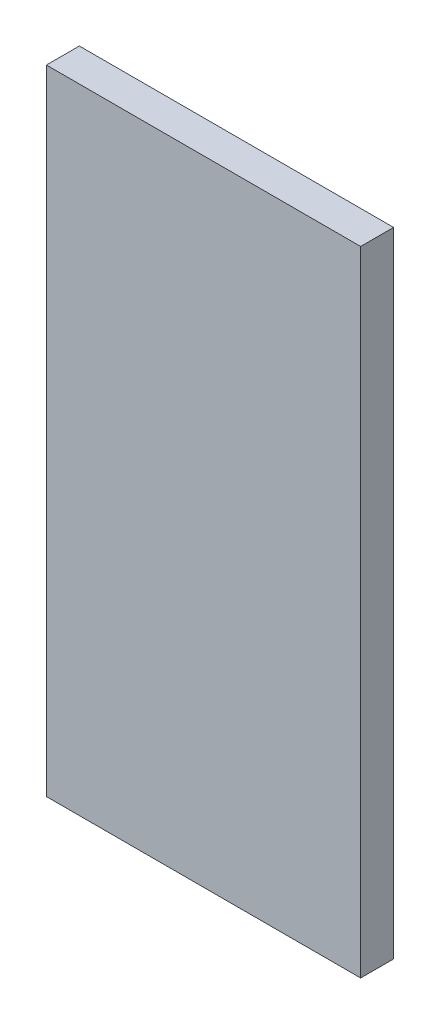
ISO-10303-21;
HEADER;
FILE_DESCRIPTION(('STEP AP214'),'2;1');
FILE_NAME('part.step','',(''),(''),'','','');
FILE_SCHEMA(('AUTOMOTIVE_DESIGN { 1 0 10303 214 1 1 1 1 }'));
ENDSEC;
DATA;
#1=APPLICATION_CONTEXT('core data for automotive mechanical design processes');
#2=APPLICATION_PROTOCOL_DEFINITION('international standard','automotive_design',2000,#1);
#3=PRODUCT_CONTEXT('',#1,'mechanical');
#4=PRODUCT('Part','Part','',(#3));
#5=PRODUCT_RELATED_PRODUCT_CATEGORY('part','',(#4));
#6=PRODUCT_DEFINITION_FORMATION('','',#4);
#7=PRODUCT_DEFINITION_CONTEXT('part definition',#1,'design');
#8=PRODUCT_DEFINITION('design','',#6,#7);
#9=PRODUCT_DEFINITION_SHAPE('','',#8);
#10=(LENGTH_UNIT() NAMED_UNIT(*) SI_UNIT(.MILLI.,.METRE.));
#11=(NAMED_UNIT(*) PLANE_ANGLE_UNIT() SI_UNIT($,.RADIAN.));
#12=(NAMED_UNIT(*) SI_UNIT($,.STERADIAN.) SOLID_ANGLE_UNIT());
#13=UNCERTAINTY_MEASURE_WITH_UNIT(LENGTH_MEASURE(1.E-05),#10,'distance_accuracy_value','');
#14=(GEOMETRIC_REPRESENTATION_CONTEXT(3) GLOBAL_UNCERTAINTY_ASSIGNED_CONTEXT((#13)) GLOBAL_UNIT_ASSIGNED_CONTEXT((#10,
#11,#12)) REPRESENTATION_CONTEXT('',''));
#15=CARTESIAN_POINT('',(0.,0.,0.));
#16=DIRECTION('',(0.,0.,1.));
#17=DIRECTION('',(1.,0.,0.));
#18=AXIS2_PLACEMENT_3D('',#15,#16,#17);
#19=CARTESIAN_POINT('',(31.,62.5,6.5));
#20=DIRECTION('',(-1.,0.,0.));
#21=DIRECTION('',(0.,-1.,0.));
#22=AXIS2_PLACEMENT_3D('',#19,#20,#21);
#23=PLANE('',#22);
#24=DIRECTION('',(0.,1.,0.));
#25=VECTOR('',#24,1.);
#26=CARTESIAN_POINT('',(31.,62.5,0.));
#27=LINE('',#26,#25);
#28=CARTESIAN_POINT('',(31.,-62.5,0.));
#29=VERTEX_POINT('',#28);
#30=CARTESIAN_POINT('',(31.,62.5,0.));
#31=VERTEX_POINT('',#30);
#32=EDGE_CURVE('E97',#29,#31,#27,.T.);
#33=ORIENTED_EDGE('',*,*,#32,.T.);
#34=DIRECTION('',(0.,0.,-1.));
#35=VECTOR('',#34,1.);
#36=CARTESIAN_POINT('',(31.,62.5,6.5));
#37=LINE('',#36,#35);
#38=CARTESIAN_POINT('',(31.,62.5,6.5));
#39=VERTEX_POINT('',#38);
#40=EDGE_CURVE('E11',#39,#31,#37,.T.);
#41=ORIENTED_EDGE('',*,*,#40,.F.);
#42=DIRECTION('',(0.,1.,0.));
#43=VECTOR('',#42,1.);
#44=CARTESIAN_POINT('',(31.,62.5,6.5));
#45=LINE('',#44,#43);
#46=CARTESIAN_POINT('',(31.,-62.5,6.5));
#47=VERTEX_POINT('',#46);
#48=EDGE_CURVE('E85',#47,#39,#45,.T.);
#49=ORIENTED_EDGE('',*,*,#48,.F.);
#50=DIRECTION('',(0.,0.,-1.));
#51=VECTOR('',#50,1.);
#52=CARTESIAN_POINT('',(31.,-62.5,6.5));
#53=LINE('',#52,#51);
#54=EDGE_CURVE('E93',#47,#29,#53,.T.);
#55=ORIENTED_EDGE('',*,*,#54,.T.);
#56=EDGE_LOOP('',(#33,#41,#49,#55));
#57=FACE_BOUND('',#56,.T.);
#58=ADVANCED_FACE('F34',(#57),#23,.F.);
#59=CARTESIAN_POINT('',(-31.,62.5,6.5));
#60=DIRECTION('',(0.,-1.,0.));
#61=DIRECTION('',(0.,0.,-1.));
#62=AXIS2_PLACEMENT_3D('',#59,#60,#61);
#63=PLANE('',#62);
#64=DIRECTION('',(-1.,0.,0.));
#65=VECTOR('',#64,1.);
#66=CARTESIAN_POINT('',(-31.,62.5,0.));
#67=LINE('',#66,#65);
#68=CARTESIAN_POINT('',(-31.,62.5,0.));
#69=VERTEX_POINT('',#68);
#70=EDGE_CURVE('E89',#31,#69,#67,.T.);
#71=ORIENTED_EDGE('',*,*,#70,.T.);
#72=DIRECTION('',(0.,0.,-1.));
#73=VECTOR('',#72,1.);
#74=CARTESIAN_POINT('',(-31.,62.5,6.5));
#75=LINE('',#74,#73);
#76=CARTESIAN_POINT('',(-31.,62.5,6.5));
#77=VERTEX_POINT('',#76);
#78=EDGE_CURVE('E42',#77,#69,#75,.T.);
#79=ORIENTED_EDGE('',*,*,#78,.F.);
#80=DIRECTION('',(-1.,0.,0.));
#81=VECTOR('',#80,1.);
#82=CARTESIAN_POINT('',(-31.,62.5,6.5));
#83=LINE('',#82,#81);
#84=EDGE_CURVE('E80',#39,#77,#83,.T.);
#85=ORIENTED_EDGE('',*,*,#84,.F.);
#86=ORIENTED_EDGE('',*,*,#40,.T.);
#87=EDGE_LOOP('',(#71,#79,#85,#86));
#88=FACE_BOUND('',#87,.T.);
#89=ADVANCED_FACE('F88',(#88),#63,.F.);
#90=CARTESIAN_POINT('',(-31.,62.5,6.5));
#91=DIRECTION('',(1.,0.,0.));
#92=DIRECTION('',(0.,1.,0.));
#93=AXIS2_PLACEMENT_3D('',#90,#91,#92);
#94=PLANE('',#93);
#95=DIRECTION('',(0.,-1.,0.));
#96=VECTOR('',#95,1.);
#97=CARTESIAN_POINT('',(-31.,62.5,0.));
#98=LINE('',#97,#96);
#99=CARTESIAN_POINT('',(-31.,-62.5,0.));
#100=VERTEX_POINT('',#99);
#101=EDGE_CURVE('E67',#69,#100,#98,.T.);
#102=ORIENTED_EDGE('',*,*,#101,.T.);
#103=DIRECTION('',(0.,0.,-1.));
#104=VECTOR('',#103,1.);
#105=CARTESIAN_POINT('',(-31.,-62.5,6.5));
#106=LINE('',#105,#104);
#107=CARTESIAN_POINT('',(-31.,-62.5,6.5));
#108=VERTEX_POINT('',#107);
#109=EDGE_CURVE('E90',#108,#100,#106,.T.);
#110=ORIENTED_EDGE('',*,*,#109,.F.);
#111=DIRECTION('',(0.,-1.,0.));
#112=VECTOR('',#111,1.);
#113=CARTESIAN_POINT('',(-31.,62.5,6.5));
#114=LINE('',#113,#112);
#115=EDGE_CURVE('E83',#77,#108,#114,.T.);
#116=ORIENTED_EDGE('',*,*,#115,.F.);
#117=ORIENTED_EDGE('',*,*,#78,.T.);
#118=EDGE_LOOP('',(#102,#110,#116,#117));
#119=FACE_BOUND('',#118,.T.);
#120=ADVANCED_FACE('F91',(#119),#94,.F.);
#121=CARTESIAN_POINT('',(-31.,-62.5,6.5));
#122=DIRECTION('',(0.,1.,0.));
#123=DIRECTION('',(0.,0.,1.));
#124=AXIS2_PLACEMENT_3D('',#121,#122,#123);
#125=PLANE('',#124);
#126=DIRECTION('',(1.,0.,0.));
#127=VECTOR('',#126,1.);
#128=CARTESIAN_POINT('',(-31.,-62.5,0.));
#129=LINE('',#128,#127);
#130=EDGE_CURVE('E73',#100,#29,#129,.T.);
#131=ORIENTED_EDGE('',*,*,#130,.T.);
#132=ORIENTED_EDGE('',*,*,#54,.F.);
#133=DIRECTION('',(1.,0.,0.));
#134=VECTOR('',#133,1.);
#135=CARTESIAN_POINT('',(-31.,-62.5,6.5));
#136=LINE('',#135,#134);
#137=EDGE_CURVE('E50',#108,#47,#136,.T.);
#138=ORIENTED_EDGE('',*,*,#137,.F.);
#139=ORIENTED_EDGE('',*,*,#109,.T.);
#140=EDGE_LOOP('',(#131,#132,#138,#139));
#141=FACE_BOUND('',#140,.T.);
#142=ADVANCED_FACE('F104',(#141),#125,.F.);
#143=CARTESIAN_POINT('',(0.,0.,6.5));
#144=DIRECTION('',(0.,0.,1.));
#145=DIRECTION('',(1.,0.,0.));
#146=AXIS2_PLACEMENT_3D('',#143,#144,#145);
#147=PLANE('',#146);
#148=ORIENTED_EDGE('',*,*,#48,.T.);
#149=ORIENTED_EDGE('',*,*,#84,.T.);
#150=ORIENTED_EDGE('',*,*,#115,.T.);
#151=ORIENTED_EDGE('',*,*,#137,.T.);
#152=EDGE_LOOP('',(#148,#149,#150,#151));
#153=FACE_BOUND('',#152,.T.);
#154=ADVANCED_FACE('F81',(#153),#147,.T.);
#155=CARTESIAN_POINT('',(0.,0.,0.));
#156=DIRECTION('',(0.,0.,1.));
#157=DIRECTION('',(1.,0.,0.));
#158=AXIS2_PLACEMENT_3D('',#155,#156,#157);
#159=PLANE('',#158);
#160=ORIENTED_EDGE('',*,*,#32,.F.);
#161=ORIENTED_EDGE('',*,*,#130,.F.);
#162=ORIENTED_EDGE('',*,*,#101,.F.);
#163=ORIENTED_EDGE('',*,*,#70,.F.);
#164=EDGE_LOOP('',(#160,#161,#162,#163));
#165=FACE_BOUND('',#164,.T.);
#166=ADVANCED_FACE('F107',(#165),#159,.F.);
#167=CLOSED_SHELL('',(#58,#89,#120,#142,#154,#166));
#168=MANIFOLD_SOLID_BREP('B2',#167);
#169=ADVANCED_BREP_SHAPE_REPRESENTATION('',(#18,#168),#14);
#170=SHAPE_DEFINITION_REPRESENTATION(#9,#169);
ENDSEC;
END-ISO-10303-21;
